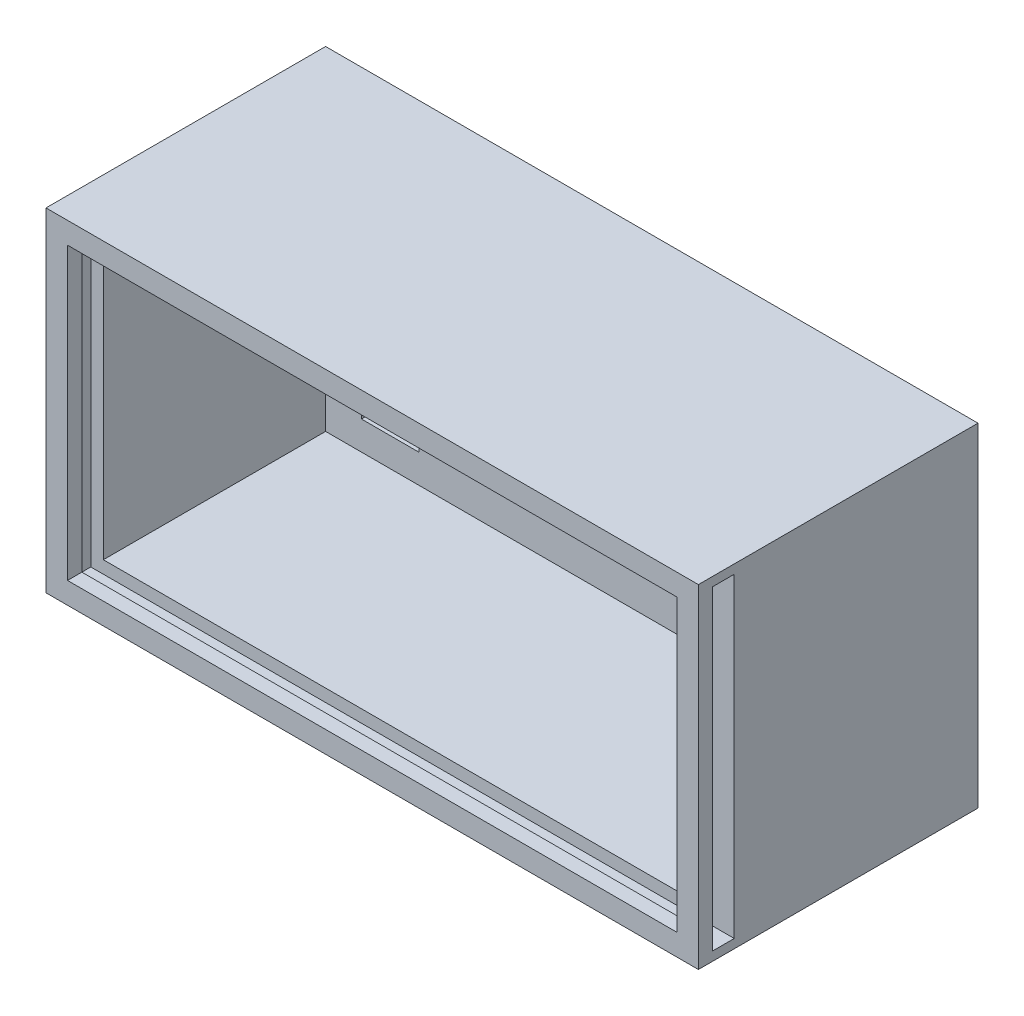
ISO-10303-21;
HEADER;
FILE_DESCRIPTION(('STEP AP214'),'2;1');
FILE_NAME('part.step','',(''),(''),'','','');
FILE_SCHEMA(('AUTOMOTIVE_DESIGN { 1 0 10303 214 1 1 1 1 }'));
ENDSEC;
DATA;
#1=APPLICATION_CONTEXT('core data for automotive mechanical design processes');
#2=APPLICATION_PROTOCOL_DEFINITION('international standard','automotive_design',2000,#1);
#3=PRODUCT_CONTEXT('',#1,'mechanical');
#4=PRODUCT('Part','Part','',(#3));
#5=PRODUCT_RELATED_PRODUCT_CATEGORY('part','',(#4));
#6=PRODUCT_DEFINITION_FORMATION('','',#4);
#7=PRODUCT_DEFINITION_CONTEXT('part definition',#1,'design');
#8=PRODUCT_DEFINITION('design','',#6,#7);
#9=PRODUCT_DEFINITION_SHAPE('','',#8);
#10=(LENGTH_UNIT() NAMED_UNIT(*) SI_UNIT(.MILLI.,.METRE.));
#11=(NAMED_UNIT(*) PLANE_ANGLE_UNIT() SI_UNIT($,.RADIAN.));
#12=(NAMED_UNIT(*) SI_UNIT($,.STERADIAN.) SOLID_ANGLE_UNIT());
#13=UNCERTAINTY_MEASURE_WITH_UNIT(LENGTH_MEASURE(1.E-05),#10,'distance_accuracy_value','');
#14=(GEOMETRIC_REPRESENTATION_CONTEXT(3) GLOBAL_UNCERTAINTY_ASSIGNED_CONTEXT((#13)) GLOBAL_UNIT_ASSIGNED_CONTEXT((#10,
#11,#12)) REPRESENTATION_CONTEXT('',''));
#15=CARTESIAN_POINT('',(0.,0.,0.));
#16=DIRECTION('',(0.,0.,1.));
#17=DIRECTION('',(1.,0.,0.));
#18=AXIS2_PLACEMENT_3D('',#15,#16,#17);
#19=CARTESIAN_POINT('',(0.,0.,36.));
#20=DIRECTION('',(0.,0.,-1.));
#21=DIRECTION('',(-1.,0.,0.));
#22=AXIS2_PLACEMENT_3D('',#19,#20,#21);
#23=PLANE('',#22);
#24=DIRECTION('',(0.,-1.,0.));
#25=VECTOR('',#24,1.);
#26=CARTESIAN_POINT('',(-45.5,23.25,36.));
#27=LINE('',#26,#25);
#28=CARTESIAN_POINT('',(-45.5,23.25,36.));
#29=VERTEX_POINT('',#28);
#30=CARTESIAN_POINT('',(-45.5,-23.25,36.));
#31=VERTEX_POINT('',#30);
#32=EDGE_CURVE('E337',#29,#31,#27,.T.);
#33=ORIENTED_EDGE('',*,*,#32,.T.);
#34=DIRECTION('',(1.,0.,0.));
#35=VECTOR('',#34,1.);
#36=CARTESIAN_POINT('',(45.5,-23.25,36.));
#37=LINE('',#36,#35);
#38=CARTESIAN_POINT('',(45.5,-23.25,36.));
#39=VERTEX_POINT('',#38);
#40=EDGE_CURVE('E340',#31,#39,#37,.T.);
#41=ORIENTED_EDGE('',*,*,#40,.T.);
#42=DIRECTION('',(0.,1.,0.));
#43=VECTOR('',#42,1.);
#44=CARTESIAN_POINT('',(45.5,23.25,36.));
#45=LINE('',#44,#43);
#46=CARTESIAN_POINT('',(45.5,23.25,36.));
#47=VERTEX_POINT('',#46);
#48=EDGE_CURVE('E342',#39,#47,#45,.T.);
#49=ORIENTED_EDGE('',*,*,#48,.T.);
#50=DIRECTION('',(-1.,0.,0.));
#51=VECTOR('',#50,1.);
#52=CARTESIAN_POINT('',(45.5,23.25,36.));
#53=LINE('',#52,#51);
#54=EDGE_CURVE('E344',#47,#29,#53,.T.);
#55=ORIENTED_EDGE('',*,*,#54,.T.);
#56=EDGE_LOOP('',(#33,#41,#49,#55));
#57=FACE_BOUND('',#56,.T.);
#58=DIRECTION('',(0.,-1.,0.));
#59=VECTOR('',#58,1.);
#60=CARTESIAN_POINT('',(-42.5,20.25,36.));
#61=LINE('',#60,#59);
#62=CARTESIAN_POINT('',(-42.5,20.25,36.));
#63=VERTEX_POINT('',#62);
#64=CARTESIAN_POINT('',(-42.5,-20.25,36.));
#65=VERTEX_POINT('',#64);
#66=EDGE_CURVE('E301',#63,#65,#61,.T.);
#67=ORIENTED_EDGE('',*,*,#66,.F.);
#68=DIRECTION('',(-1.,0.,0.));
#69=VECTOR('',#68,1.);
#70=CARTESIAN_POINT('',(-42.5,20.25,36.));
#71=LINE('',#70,#69);
#72=CARTESIAN_POINT('',(42.5,20.25,36.));
#73=VERTEX_POINT('',#72);
#74=EDGE_CURVE('E309',#73,#63,#71,.T.);
#75=ORIENTED_EDGE('',*,*,#74,.F.);
#76=DIRECTION('',(0.,1.,0.));
#77=VECTOR('',#76,1.);
#78=CARTESIAN_POINT('',(42.5,20.25,36.));
#79=LINE('',#78,#77);
#80=CARTESIAN_POINT('',(42.5,-20.25,36.));
#81=VERTEX_POINT('',#80);
#82=EDGE_CURVE('E306',#81,#73,#79,.T.);
#83=ORIENTED_EDGE('',*,*,#82,.F.);
#84=DIRECTION('',(1.,0.,0.));
#85=VECTOR('',#84,1.);
#86=CARTESIAN_POINT('',(-42.5,-20.25,36.));
#87=LINE('',#86,#85);
#88=EDGE_CURVE('E303',#65,#81,#87,.T.);
#89=ORIENTED_EDGE('',*,*,#88,.F.);
#90=EDGE_LOOP('',(#67,#75,#83,#89));
#91=FACE_BOUND('',#90,.T.);
#92=ADVANCED_FACE('F35',(#57,#91),#23,.F.);
#93=CARTESIAN_POINT('',(-45.5,23.25,36.));
#94=DIRECTION('',(1.,0.,0.));
#95=DIRECTION('',(0.,1.,0.));
#96=AXIS2_PLACEMENT_3D('',#93,#94,#95);
#97=PLANE('',#96);
#98=DIRECTION('',(0.,0.,-1.));
#99=VECTOR('',#98,1.);
#100=CARTESIAN_POINT('',(-45.5,23.25,36.));
#101=LINE('',#100,#99);
#102=CARTESIAN_POINT('',(-45.5,23.25,-3.));
#103=VERTEX_POINT('',#102);
#104=EDGE_CURVE('E346',#29,#103,#101,.T.);
#105=ORIENTED_EDGE('',*,*,#104,.T.);
#106=DIRECTION('',(0.,1.,0.));
#107=VECTOR('',#106,1.);
#108=CARTESIAN_POINT('',(-45.5,23.25,-3.));
#109=LINE('',#108,#107);
#110=CARTESIAN_POINT('',(-45.5,-23.25,-3.));
#111=VERTEX_POINT('',#110);
#112=EDGE_CURVE('E294',#111,#103,#109,.T.);
#113=ORIENTED_EDGE('',*,*,#112,.F.);
#114=DIRECTION('',(0.,0.,-1.));
#115=VECTOR('',#114,1.);
#116=CARTESIAN_POINT('',(-45.5,-23.25,36.));
#117=LINE('',#116,#115);
#118=EDGE_CURVE('E352',#31,#111,#117,.T.);
#119=ORIENTED_EDGE('',*,*,#118,.F.);
#120=ORIENTED_EDGE('',*,*,#32,.F.);
#121=EDGE_LOOP('',(#105,#113,#119,#120));
#122=FACE_BOUND('',#121,.T.);
#123=ADVANCED_FACE('F37',(#122),#97,.F.);
#124=CARTESIAN_POINT('',(45.5,-23.25,36.));
#125=DIRECTION('',(0.,1.,0.));
#126=DIRECTION('',(-1.,0.,0.));
#127=AXIS2_PLACEMENT_3D('',#124,#125,#126);
#128=PLANE('',#127);
#129=ORIENTED_EDGE('',*,*,#118,.T.);
#130=DIRECTION('',(-1.,0.,0.));
#131=VECTOR('',#130,1.);
#132=CARTESIAN_POINT('',(45.5,-23.25,-3.));
#133=LINE('',#132,#131);
#134=CARTESIAN_POINT('',(45.5,-23.25,-3.));
#135=VERTEX_POINT('',#134);
#136=EDGE_CURVE('E291',#135,#111,#133,.T.);
#137=ORIENTED_EDGE('',*,*,#136,.F.);
#138=DIRECTION('',(0.,0.,-1.));
#139=VECTOR('',#138,1.);
#140=CARTESIAN_POINT('',(45.5,-23.25,36.));
#141=LINE('',#140,#139);
#142=EDGE_CURVE('E350',#39,#135,#141,.T.);
#143=ORIENTED_EDGE('',*,*,#142,.F.);
#144=ORIENTED_EDGE('',*,*,#40,.F.);
#145=EDGE_LOOP('',(#129,#137,#143,#144));
#146=FACE_BOUND('',#145,.T.);
#147=ADVANCED_FACE('F405',(#146),#128,.F.);
#148=CARTESIAN_POINT('',(45.5,23.25,36.));
#149=DIRECTION('',(-1.,0.,0.));
#150=DIRECTION('',(0.,-1.,0.));
#151=AXIS2_PLACEMENT_3D('',#148,#149,#150);
#152=PLANE('',#151);
#153=DIRECTION('',(0.,0.,-1.));
#154=VECTOR('',#153,1.);
#155=CARTESIAN_POINT('',(45.5,-22.,36.));
#156=LINE('',#155,#154);
#157=CARTESIAN_POINT('',(45.5,-22.,34.));
#158=VERTEX_POINT('',#157);
#159=CARTESIAN_POINT('',(45.5,-22.,31.));
#160=VERTEX_POINT('',#159);
#161=EDGE_CURVE('E361',#158,#160,#156,.T.);
#162=ORIENTED_EDGE('',*,*,#161,.F.);
#163=DIRECTION('',(0.,1.,0.));
#164=VECTOR('',#163,1.);
#165=CARTESIAN_POINT('',(45.5,23.25,34.));
#166=LINE('',#165,#164);
#167=CARTESIAN_POINT('',(45.5,22.,34.));
#168=VERTEX_POINT('',#167);
#169=EDGE_CURVE('E285',#158,#168,#166,.T.);
#170=ORIENTED_EDGE('',*,*,#169,.T.);
#171=DIRECTION('',(0.,0.,1.));
#172=VECTOR('',#171,1.);
#173=CARTESIAN_POINT('',(45.5,22.,36.));
#174=LINE('',#173,#172);
#175=CARTESIAN_POINT('',(45.5,22.,31.));
#176=VERTEX_POINT('',#175);
#177=EDGE_CURVE('E359',#176,#168,#174,.T.);
#178=ORIENTED_EDGE('',*,*,#177,.F.);
#179=DIRECTION('',(0.,1.,0.));
#180=VECTOR('',#179,1.);
#181=CARTESIAN_POINT('',(45.5,23.25,31.));
#182=LINE('',#181,#180);
#183=EDGE_CURVE('E277',#160,#176,#182,.T.);
#184=ORIENTED_EDGE('',*,*,#183,.F.);
#185=EDGE_LOOP('',(#162,#170,#178,#184));
#186=FACE_BOUND('',#185,.T.);
#187=ORIENTED_EDGE('',*,*,#142,.T.);
#188=DIRECTION('',(0.,-1.,0.));
#189=VECTOR('',#188,1.);
#190=CARTESIAN_POINT('',(45.5,23.25,-3.));
#191=LINE('',#190,#189);
#192=CARTESIAN_POINT('',(45.5,23.25,-3.));
#193=VERTEX_POINT('',#192);
#194=EDGE_CURVE('E288',#193,#135,#191,.T.);
#195=ORIENTED_EDGE('',*,*,#194,.F.);
#196=DIRECTION('',(0.,0.,-1.));
#197=VECTOR('',#196,1.);
#198=CARTESIAN_POINT('',(45.5,23.25,36.));
#199=LINE('',#198,#197);
#200=EDGE_CURVE('E348',#47,#193,#199,.T.);
#201=ORIENTED_EDGE('',*,*,#200,.F.);
#202=ORIENTED_EDGE('',*,*,#48,.F.);
#203=EDGE_LOOP('',(#187,#195,#201,#202));
#204=FACE_BOUND('',#203,.T.);
#205=ADVANCED_FACE('F415',(#186,#204),#152,.F.);
#206=CARTESIAN_POINT('',(45.5,23.25,36.));
#207=DIRECTION('',(0.,-1.,0.));
#208=DIRECTION('',(1.,0.,0.));
#209=AXIS2_PLACEMENT_3D('',#206,#207,#208);
#210=PLANE('',#209);
#211=ORIENTED_EDGE('',*,*,#200,.T.);
#212=DIRECTION('',(1.,0.,0.));
#213=VECTOR('',#212,1.);
#214=CARTESIAN_POINT('',(45.5,23.25,-3.));
#215=LINE('',#214,#213);
#216=EDGE_CURVE('E297',#103,#193,#215,.T.);
#217=ORIENTED_EDGE('',*,*,#216,.F.);
#218=ORIENTED_EDGE('',*,*,#104,.F.);
#219=ORIENTED_EDGE('',*,*,#54,.F.);
#220=EDGE_LOOP('',(#211,#217,#218,#219));
#221=FACE_BOUND('',#220,.T.);
#222=ADVANCED_FACE('F412',(#221),#210,.F.);
#223=CARTESIAN_POINT('',(-42.5,20.25,36.));
#224=DIRECTION('',(1.,0.,0.));
#225=DIRECTION('',(0.,1.,0.));
#226=AXIS2_PLACEMENT_3D('',#223,#224,#225);
#227=PLANE('',#226);
#228=DIRECTION('',(0.,-1.,0.));
#229=VECTOR('',#228,1.);
#230=CARTESIAN_POINT('',(-42.5,20.25,34.));
#231=LINE('',#230,#229);
#232=CARTESIAN_POINT('',(-42.5,20.25,34.));
#233=VERTEX_POINT('',#232);
#234=CARTESIAN_POINT('',(-42.5,-20.25,34.));
#235=VERTEX_POINT('',#234);
#236=EDGE_CURVE('E283',#233,#235,#231,.T.);
#237=ORIENTED_EDGE('',*,*,#236,.F.);
#238=DIRECTION('',(0.,0.,-1.));
#239=VECTOR('',#238,1.);
#240=CARTESIAN_POINT('',(-42.5,20.25,36.));
#241=LINE('',#240,#239);
#242=EDGE_CURVE('E322',#63,#233,#241,.T.);
#243=ORIENTED_EDGE('',*,*,#242,.F.);
#244=ORIENTED_EDGE('',*,*,#66,.T.);
#245=DIRECTION('',(0.,0.,-1.));
#246=VECTOR('',#245,1.);
#247=CARTESIAN_POINT('',(-42.5,-20.25,36.));
#248=LINE('',#247,#246);
#249=EDGE_CURVE('E334',#65,#235,#248,.T.);
#250=ORIENTED_EDGE('',*,*,#249,.T.);
#251=EDGE_LOOP('',(#237,#243,#244,#250));
#252=FACE_BOUND('',#251,.T.);
#253=ADVANCED_FACE('F410',(#252),#227,.T.);
#254=CARTESIAN_POINT('',(-42.5,-20.25,36.));
#255=DIRECTION('',(0.,1.,0.));
#256=DIRECTION('',(-1.,0.,0.));
#257=AXIS2_PLACEMENT_3D('',#254,#255,#256);
#258=PLANE('',#257);
#259=DIRECTION('',(1.,0.,0.));
#260=VECTOR('',#259,1.);
#261=CARTESIAN_POINT('',(-42.5,-20.25,34.));
#262=LINE('',#261,#260);
#263=CARTESIAN_POINT('',(42.5,-20.25,34.));
#264=VERTEX_POINT('',#263);
#265=EDGE_CURVE('E281',#235,#264,#262,.T.);
#266=ORIENTED_EDGE('',*,*,#265,.F.);
#267=ORIENTED_EDGE('',*,*,#249,.F.);
#268=ORIENTED_EDGE('',*,*,#88,.T.);
#269=DIRECTION('',(0.,0.,-1.));
#270=VECTOR('',#269,1.);
#271=CARTESIAN_POINT('',(42.5,-20.25,36.));
#272=LINE('',#271,#270);
#273=EDGE_CURVE('E330',#81,#264,#272,.T.);
#274=ORIENTED_EDGE('',*,*,#273,.T.);
#275=EDGE_LOOP('',(#266,#267,#268,#274));
#276=FACE_BOUND('',#275,.T.);
#277=ADVANCED_FACE('F457',(#276),#258,.T.);
#278=CARTESIAN_POINT('',(42.5,20.25,36.));
#279=DIRECTION('',(-1.,0.,0.));
#280=DIRECTION('',(0.,-1.,0.));
#281=AXIS2_PLACEMENT_3D('',#278,#279,#280);
#282=PLANE('',#281);
#283=DIRECTION('',(0.,1.,0.));
#284=VECTOR('',#283,1.);
#285=CARTESIAN_POINT('',(42.5,20.25,34.));
#286=LINE('',#285,#284);
#287=CARTESIAN_POINT('',(42.5,20.25,34.));
#288=VERTEX_POINT('',#287);
#289=EDGE_CURVE('E279',#264,#288,#286,.T.);
#290=ORIENTED_EDGE('',*,*,#289,.F.);
#291=ORIENTED_EDGE('',*,*,#273,.F.);
#292=ORIENTED_EDGE('',*,*,#82,.T.);
#293=DIRECTION('',(0.,0.,-1.));
#294=VECTOR('',#293,1.);
#295=CARTESIAN_POINT('',(42.5,20.25,36.));
#296=LINE('',#295,#294);
#297=EDGE_CURVE('E326',#73,#288,#296,.T.);
#298=ORIENTED_EDGE('',*,*,#297,.T.);
#299=EDGE_LOOP('',(#290,#291,#292,#298));
#300=FACE_BOUND('',#299,.T.);
#301=ADVANCED_FACE('F447',(#300),#282,.T.);
#302=CARTESIAN_POINT('',(-42.5,20.25,36.));
#303=DIRECTION('',(0.,-1.,0.));
#304=DIRECTION('',(1.,0.,0.));
#305=AXIS2_PLACEMENT_3D('',#302,#303,#304);
#306=PLANE('',#305);
#307=DIRECTION('',(-1.,0.,0.));
#308=VECTOR('',#307,1.);
#309=CARTESIAN_POINT('',(-42.5,20.25,34.));
#310=LINE('',#309,#308);
#311=EDGE_CURVE('E357',#288,#233,#310,.T.);
#312=ORIENTED_EDGE('',*,*,#311,.F.);
#313=ORIENTED_EDGE('',*,*,#297,.F.);
#314=ORIENTED_EDGE('',*,*,#74,.T.);
#315=ORIENTED_EDGE('',*,*,#242,.T.);
#316=EDGE_LOOP('',(#312,#313,#314,#315));
#317=FACE_BOUND('',#316,.T.);
#318=ADVANCED_FACE('F438',(#317),#306,.T.);
#319=CARTESIAN_POINT('',(0.,0.,-3.));
#320=DIRECTION('',(0.,0.,-1.));
#321=DIRECTION('',(-1.,0.,0.));
#322=AXIS2_PLACEMENT_3D('',#319,#320,#321);
#323=PLANE('',#322);
#324=DIRECTION('',(0.,-1.,0.));
#325=VECTOR('',#324,1.);
#326=CARTESIAN_POINT('',(-29.5,-4.25000000000001,-3.));
#327=LINE('',#326,#325);
#328=CARTESIAN_POINT('',(-29.5,-4.25000000000001,-3.));
#329=VERTEX_POINT('',#328);
#330=CARTESIAN_POINT('',(-29.5,-16.25,-3.));
#331=VERTEX_POINT('',#330);
#332=EDGE_CURVE('E50',#329,#331,#327,.T.);
#333=ORIENTED_EDGE('',*,*,#332,.F.);
#334=DIRECTION('',(1.,0.,0.));
#335=VECTOR('',#334,1.);
#336=CARTESIAN_POINT('',(-29.5,-4.25000000000001,-3.));
#337=LINE('',#336,#335);
#338=CARTESIAN_POINT('',(-37.5,-4.25000000000001,-3.));
#339=VERTEX_POINT('',#338);
#340=EDGE_CURVE('E220',#339,#329,#337,.T.);
#341=ORIENTED_EDGE('',*,*,#340,.F.);
#342=DIRECTION('',(0.,1.,0.));
#343=VECTOR('',#342,1.);
#344=CARTESIAN_POINT('',(-37.5,-4.25000000000001,-3.));
#345=LINE('',#344,#343);
#346=CARTESIAN_POINT('',(-37.5,-16.25,-3.));
#347=VERTEX_POINT('',#346);
#348=EDGE_CURVE('E203',#347,#339,#345,.T.);
#349=ORIENTED_EDGE('',*,*,#348,.F.);
#350=DIRECTION('',(-1.,0.,0.));
#351=VECTOR('',#350,1.);
#352=CARTESIAN_POINT('',(-29.5,-16.25,-3.));
#353=LINE('',#352,#351);
#354=EDGE_CURVE('E213',#331,#347,#353,.T.);
#355=ORIENTED_EDGE('',*,*,#354,.F.);
#356=EDGE_LOOP('',(#333,#341,#349,#355));
#357=FACE_BOUND('',#356,.T.);
#358=DIRECTION('',(0.,-1.,0.));
#359=VECTOR('',#358,1.);
#360=CARTESIAN_POINT('',(40.1486426321158,17.25,-3.));
#361=LINE('',#360,#359);
#362=CARTESIAN_POINT('',(40.1486426321158,17.25,-3.));
#363=VERTEX_POINT('',#362);
#364=CARTESIAN_POINT('',(40.1486426321158,9.25000000000005,-3.));
#365=VERTEX_POINT('',#364);
#366=EDGE_CURVE('E58',#363,#365,#361,.T.);
#367=ORIENTED_EDGE('',*,*,#366,.F.);
#368=DIRECTION('',(1.,0.,0.));
#369=VECTOR('',#368,1.);
#370=CARTESIAN_POINT('',(40.1486426321158,17.25,-3.));
#371=LINE('',#370,#369);
#372=CARTESIAN_POINT('',(35.1486426321158,17.25,-3.));
#373=VERTEX_POINT('',#372);
#374=EDGE_CURVE('E237',#373,#363,#371,.T.);
#375=ORIENTED_EDGE('',*,*,#374,.F.);
#376=DIRECTION('',(0.,1.,0.));
#377=VECTOR('',#376,1.);
#378=CARTESIAN_POINT('',(35.1486426321158,17.25,-3.));
#379=LINE('',#378,#377);
#380=CARTESIAN_POINT('',(35.1486426321158,9.25000000000005,-3.));
#381=VERTEX_POINT('',#380);
#382=EDGE_CURVE('E234',#381,#373,#379,.T.);
#383=ORIENTED_EDGE('',*,*,#382,.F.);
#384=DIRECTION('',(-1.,0.,0.));
#385=VECTOR('',#384,1.);
#386=CARTESIAN_POINT('',(40.1486426321158,9.25000000000005,-3.));
#387=LINE('',#386,#385);
#388=EDGE_CURVE('E231',#365,#381,#387,.T.);
#389=ORIENTED_EDGE('',*,*,#388,.F.);
#390=EDGE_LOOP('',(#367,#375,#383,#389));
#391=FACE_BOUND('',#390,.T.);
#392=ORIENTED_EDGE('',*,*,#194,.T.);
#393=ORIENTED_EDGE('',*,*,#136,.T.);
#394=ORIENTED_EDGE('',*,*,#112,.T.);
#395=ORIENTED_EDGE('',*,*,#216,.T.);
#396=EDGE_LOOP('',(#392,#393,#394,#395));
#397=FACE_BOUND('',#396,.T.);
#398=ADVANCED_FACE('F217',(#357,#391,#397),#323,.T.);
#399=CARTESIAN_POINT('',(-44.25,-22.,34.));
#400=DIRECTION('',(0.,1.,0.));
#401=DIRECTION('',(-1.,0.,0.));
#402=AXIS2_PLACEMENT_3D('',#399,#400,#401);
#403=PLANE('',#402);
#404=ORIENTED_EDGE('',*,*,#161,.T.);
#405=DIRECTION('',(1.,0.,0.));
#406=VECTOR('',#405,1.);
#407=CARTESIAN_POINT('',(-44.25,-22.,31.));
#408=LINE('',#407,#406);
#409=CARTESIAN_POINT('',(-44.25,-22.,31.));
#410=VERTEX_POINT('',#409);
#411=EDGE_CURVE('E260',#410,#160,#408,.T.);
#412=ORIENTED_EDGE('',*,*,#411,.F.);
#413=DIRECTION('',(0.,0.,-1.));
#414=VECTOR('',#413,1.);
#415=CARTESIAN_POINT('',(-44.25,-22.,34.));
#416=LINE('',#415,#414);
#417=CARTESIAN_POINT('',(-44.25,-22.,34.));
#418=VERTEX_POINT('',#417);
#419=EDGE_CURVE('E265',#418,#410,#416,.T.);
#420=ORIENTED_EDGE('',*,*,#419,.F.);
#421=DIRECTION('',(1.,0.,0.));
#422=VECTOR('',#421,1.);
#423=CARTESIAN_POINT('',(-44.25,-22.,34.));
#424=LINE('',#423,#422);
#425=EDGE_CURVE('E251',#418,#158,#424,.T.);
#426=ORIENTED_EDGE('',*,*,#425,.T.);
#427=EDGE_LOOP('',(#404,#412,#420,#426));
#428=FACE_BOUND('',#427,.T.);
#429=ADVANCED_FACE('F437',(#428),#403,.T.);
#430=CARTESIAN_POINT('',(-44.25,22.,34.));
#431=DIRECTION('',(0.,-1.,0.));
#432=DIRECTION('',(0.,0.,-1.));
#433=AXIS2_PLACEMENT_3D('',#430,#431,#432);
#434=PLANE('',#433);
#435=ORIENTED_EDGE('',*,*,#177,.T.);
#436=DIRECTION('',(-1.,0.,0.));
#437=VECTOR('',#436,1.);
#438=CARTESIAN_POINT('',(-44.25,22.,34.));
#439=LINE('',#438,#437);
#440=CARTESIAN_POINT('',(-44.25,22.,34.));
#441=VERTEX_POINT('',#440);
#442=EDGE_CURVE('E255',#168,#441,#439,.T.);
#443=ORIENTED_EDGE('',*,*,#442,.T.);
#444=DIRECTION('',(0.,0.,-1.));
#445=VECTOR('',#444,1.);
#446=CARTESIAN_POINT('',(-44.25,22.,34.));
#447=LINE('',#446,#445);
#448=CARTESIAN_POINT('',(-44.25,22.,31.));
#449=VERTEX_POINT('',#448);
#450=EDGE_CURVE('E257',#441,#449,#447,.T.);
#451=ORIENTED_EDGE('',*,*,#450,.T.);
#452=DIRECTION('',(-1.,0.,0.));
#453=VECTOR('',#452,1.);
#454=CARTESIAN_POINT('',(-44.25,22.,31.));
#455=LINE('',#454,#453);
#456=EDGE_CURVE('E252',#176,#449,#455,.T.);
#457=ORIENTED_EDGE('',*,*,#456,.F.);
#458=EDGE_LOOP('',(#435,#443,#451,#457));
#459=FACE_BOUND('',#458,.T.);
#460=ADVANCED_FACE('F444',(#459),#434,.T.);
#461=CARTESIAN_POINT('',(0.,0.,34.));
#462=DIRECTION('',(0.,0.,1.));
#463=DIRECTION('',(1.,0.,0.));
#464=AXIS2_PLACEMENT_3D('',#461,#462,#463);
#465=PLANE('',#464);
#466=ORIENTED_EDGE('',*,*,#236,.T.);
#467=ORIENTED_EDGE('',*,*,#265,.T.);
#468=ORIENTED_EDGE('',*,*,#289,.T.);
#469=ORIENTED_EDGE('',*,*,#311,.T.);
#470=EDGE_LOOP('',(#466,#467,#468,#469));
#471=FACE_BOUND('',#470,.T.);
#472=ORIENTED_EDGE('',*,*,#425,.F.);
#473=DIRECTION('',(0.,-1.,0.));
#474=VECTOR('',#473,1.);
#475=CARTESIAN_POINT('',(-44.25,22.,34.));
#476=LINE('',#475,#474);
#477=EDGE_CURVE('E248',#441,#418,#476,.T.);
#478=ORIENTED_EDGE('',*,*,#477,.F.);
#479=ORIENTED_EDGE('',*,*,#442,.F.);
#480=ORIENTED_EDGE('',*,*,#169,.F.);
#481=EDGE_LOOP('',(#472,#478,#479,#480));
#482=FACE_BOUND('',#481,.T.);
#483=ADVANCED_FACE('F585',(#471,#482),#465,.F.);
#484=CARTESIAN_POINT('',(0.,0.,31.));
#485=DIRECTION('',(0.,0.,1.));
#486=DIRECTION('',(1.,0.,0.));
#487=AXIS2_PLACEMENT_3D('',#484,#485,#486);
#488=PLANE('',#487);
#489=DIRECTION('',(-1.,0.,0.));
#490=VECTOR('',#489,1.);
#491=CARTESIAN_POINT('',(-42.5,20.25,31.));
#492=LINE('',#491,#490);
#493=CARTESIAN_POINT('',(42.5,20.25,31.));
#494=VERTEX_POINT('',#493);
#495=CARTESIAN_POINT('',(-42.5,20.25,31.));
#496=VERTEX_POINT('',#495);
#497=EDGE_CURVE('E354',#494,#496,#492,.T.);
#498=ORIENTED_EDGE('',*,*,#497,.F.);
#499=DIRECTION('',(0.,1.,0.));
#500=VECTOR('',#499,1.);
#501=CARTESIAN_POINT('',(42.5,20.25,31.));
#502=LINE('',#501,#500);
#503=CARTESIAN_POINT('',(42.5,-20.25,31.));
#504=VERTEX_POINT('',#503);
#505=EDGE_CURVE('E268',#504,#494,#502,.T.);
#506=ORIENTED_EDGE('',*,*,#505,.F.);
#507=DIRECTION('',(1.,0.,0.));
#508=VECTOR('',#507,1.);
#509=CARTESIAN_POINT('',(-42.5,-20.25,31.));
#510=LINE('',#509,#508);
#511=CARTESIAN_POINT('',(-42.5,-20.25,31.));
#512=VERTEX_POINT('',#511);
#513=EDGE_CURVE('E271',#512,#504,#510,.T.);
#514=ORIENTED_EDGE('',*,*,#513,.F.);
#515=DIRECTION('',(0.,-1.,0.));
#516=VECTOR('',#515,1.);
#517=CARTESIAN_POINT('',(-42.5,20.25,31.));
#518=LINE('',#517,#516);
#519=EDGE_CURVE('E274',#496,#512,#518,.T.);
#520=ORIENTED_EDGE('',*,*,#519,.F.);
#521=EDGE_LOOP('',(#498,#506,#514,#520));
#522=FACE_BOUND('',#521,.T.);
#523=ORIENTED_EDGE('',*,*,#183,.T.);
#524=ORIENTED_EDGE('',*,*,#456,.T.);
#525=DIRECTION('',(0.,-1.,0.));
#526=VECTOR('',#525,1.);
#527=CARTESIAN_POINT('',(-44.25,22.,31.));
#528=LINE('',#527,#526);
#529=EDGE_CURVE('E227',#449,#410,#528,.T.);
#530=ORIENTED_EDGE('',*,*,#529,.T.);
#531=ORIENTED_EDGE('',*,*,#411,.T.);
#532=EDGE_LOOP('',(#523,#524,#530,#531));
#533=FACE_BOUND('',#532,.T.);
#534=ADVANCED_FACE('F484',(#522,#533),#488,.T.);
#535=CARTESIAN_POINT('',(-44.25,22.,34.));
#536=DIRECTION('',(1.,0.,0.));
#537=DIRECTION('',(0.,1.,0.));
#538=AXIS2_PLACEMENT_3D('',#535,#536,#537);
#539=PLANE('',#538);
#540=ORIENTED_EDGE('',*,*,#529,.F.);
#541=ORIENTED_EDGE('',*,*,#450,.F.);
#542=ORIENTED_EDGE('',*,*,#477,.T.);
#543=ORIENTED_EDGE('',*,*,#419,.T.);
#544=EDGE_LOOP('',(#540,#541,#542,#543));
#545=FACE_BOUND('',#544,.T.);
#546=ADVANCED_FACE('F453',(#545),#539,.T.);
#547=CARTESIAN_POINT('',(0.,0.,0.));
#548=DIRECTION('',(0.,0.,-1.));
#549=DIRECTION('',(-1.,0.,0.));
#550=AXIS2_PLACEMENT_3D('',#547,#548,#549);
#551=PLANE('',#550);
#552=DIRECTION('',(1.,0.,0.));
#553=VECTOR('',#552,1.);
#554=CARTESIAN_POINT('',(0.,-4.25000000000001,0.));
#555=LINE('',#554,#553);
#556=CARTESIAN_POINT('',(-37.5,-4.25000000000001,0.));
#557=VERTEX_POINT('',#556);
#558=CARTESIAN_POINT('',(-29.5,-4.25000000000001,0.));
#559=VERTEX_POINT('',#558);
#560=EDGE_CURVE('E43',#557,#559,#555,.T.);
#561=ORIENTED_EDGE('',*,*,#560,.T.);
#562=DIRECTION('',(0.,-1.,0.));
#563=VECTOR('',#562,1.);
#564=CARTESIAN_POINT('',(-29.5,0.,0.));
#565=LINE('',#564,#563);
#566=CARTESIAN_POINT('',(-29.5,-16.25,0.));
#567=VERTEX_POINT('',#566);
#568=EDGE_CURVE('E11',#559,#567,#565,.T.);
#569=ORIENTED_EDGE('',*,*,#568,.T.);
#570=DIRECTION('',(-1.,0.,0.));
#571=VECTOR('',#570,1.);
#572=CARTESIAN_POINT('',(0.,-16.25,0.));
#573=LINE('',#572,#571);
#574=CARTESIAN_POINT('',(-37.5,-16.25,0.));
#575=VERTEX_POINT('',#574);
#576=EDGE_CURVE('E376',#567,#575,#573,.T.);
#577=ORIENTED_EDGE('',*,*,#576,.T.);
#578=DIRECTION('',(0.,1.,0.));
#579=VECTOR('',#578,1.);
#580=CARTESIAN_POINT('',(-37.5,0.,0.));
#581=LINE('',#580,#579);
#582=EDGE_CURVE('E206',#575,#557,#581,.T.);
#583=ORIENTED_EDGE('',*,*,#582,.T.);
#584=EDGE_LOOP('',(#561,#569,#577,#583));
#585=FACE_BOUND('',#584,.T.);
#586=DIRECTION('',(1.,0.,0.));
#587=VECTOR('',#586,1.);
#588=CARTESIAN_POINT('',(0.,17.2500000000001,0.));
#589=LINE('',#588,#587);
#590=CARTESIAN_POINT('',(35.1486426321158,17.25,0.));
#591=VERTEX_POINT('',#590);
#592=CARTESIAN_POINT('',(40.1486426321158,17.25,0.));
#593=VERTEX_POINT('',#592);
#594=EDGE_CURVE('E370',#591,#593,#589,.T.);
#595=ORIENTED_EDGE('',*,*,#594,.T.);
#596=DIRECTION('',(0.,-1.,0.));
#597=VECTOR('',#596,1.);
#598=CARTESIAN_POINT('',(40.1486426321158,0.,0.));
#599=LINE('',#598,#597);
#600=CARTESIAN_POINT('',(40.1486426321158,9.25000000000005,0.));
#601=VERTEX_POINT('',#600);
#602=EDGE_CURVE('E373',#593,#601,#599,.T.);
#603=ORIENTED_EDGE('',*,*,#602,.T.);
#604=DIRECTION('',(-1.,0.,0.));
#605=VECTOR('',#604,1.);
#606=CARTESIAN_POINT('',(0.,9.25000000000005,0.));
#607=LINE('',#606,#605);
#608=CARTESIAN_POINT('',(35.1486426321158,9.25000000000005,0.));
#609=VERTEX_POINT('',#608);
#610=EDGE_CURVE('E364',#601,#609,#607,.T.);
#611=ORIENTED_EDGE('',*,*,#610,.T.);
#612=DIRECTION('',(0.,1.,0.));
#613=VECTOR('',#612,1.);
#614=CARTESIAN_POINT('',(35.1486426321158,0.,0.));
#615=LINE('',#614,#613);
#616=EDGE_CURVE('E367',#609,#591,#615,.T.);
#617=ORIENTED_EDGE('',*,*,#616,.T.);
#618=EDGE_LOOP('',(#595,#603,#611,#617));
#619=FACE_BOUND('',#618,.T.);
#620=DIRECTION('',(0.,1.,0.));
#621=VECTOR('',#620,1.);
#622=CARTESIAN_POINT('',(42.5,20.25,0.));
#623=LINE('',#622,#621);
#624=CARTESIAN_POINT('',(42.5,-20.25,0.));
#625=VERTEX_POINT('',#624);
#626=CARTESIAN_POINT('',(42.5,20.25,0.));
#627=VERTEX_POINT('',#626);
#628=EDGE_CURVE('E317',#625,#627,#623,.T.);
#629=ORIENTED_EDGE('',*,*,#628,.T.);
#630=DIRECTION('',(-1.,0.,0.));
#631=VECTOR('',#630,1.);
#632=CARTESIAN_POINT('',(-42.5,20.25,0.));
#633=LINE('',#632,#631);
#634=CARTESIAN_POINT('',(-42.5,20.25,0.));
#635=VERTEX_POINT('',#634);
#636=EDGE_CURVE('E304',#627,#635,#633,.T.);
#637=ORIENTED_EDGE('',*,*,#636,.T.);
#638=DIRECTION('',(0.,-1.,0.));
#639=VECTOR('',#638,1.);
#640=CARTESIAN_POINT('',(-42.5,20.25,0.));
#641=LINE('',#640,#639);
#642=CARTESIAN_POINT('',(-42.5,-20.25,0.));
#643=VERTEX_POINT('',#642);
#644=EDGE_CURVE('E300',#635,#643,#641,.T.);
#645=ORIENTED_EDGE('',*,*,#644,.T.);
#646=DIRECTION('',(1.,0.,0.));
#647=VECTOR('',#646,1.);
#648=CARTESIAN_POINT('',(-42.5,-20.25,0.));
#649=LINE('',#648,#647);
#650=EDGE_CURVE('E314',#643,#625,#649,.T.);
#651=ORIENTED_EDGE('',*,*,#650,.T.);
#652=EDGE_LOOP('',(#629,#637,#645,#651));
#653=FACE_BOUND('',#652,.T.);
#654=ADVANCED_FACE('F380',(#585,#619,#653),#551,.F.);
#655=EDGE_CURVE('E325',#494,#627,#296,.T.);
#656=ORIENTED_EDGE('',*,*,#655,.F.);
#657=ORIENTED_EDGE('',*,*,#497,.T.);
#658=EDGE_CURVE('E311',#496,#635,#241,.T.);
#659=ORIENTED_EDGE('',*,*,#658,.T.);
#660=ORIENTED_EDGE('',*,*,#636,.F.);
#661=EDGE_LOOP('',(#656,#657,#659,#660));
#662=FACE_BOUND('',#661,.T.);
#663=ADVANCED_FACE('F450',(#662),#306,.T.);
#664=EDGE_CURVE('E329',#504,#625,#272,.T.);
#665=ORIENTED_EDGE('',*,*,#664,.F.);
#666=ORIENTED_EDGE('',*,*,#505,.T.);
#667=ORIENTED_EDGE('',*,*,#655,.T.);
#668=ORIENTED_EDGE('',*,*,#628,.F.);
#669=EDGE_LOOP('',(#665,#666,#667,#668));
#670=FACE_BOUND('',#669,.T.);
#671=ADVANCED_FACE('F459',(#670),#282,.T.);
#672=EDGE_CURVE('E333',#512,#643,#248,.T.);
#673=ORIENTED_EDGE('',*,*,#672,.F.);
#674=ORIENTED_EDGE('',*,*,#513,.T.);
#675=ORIENTED_EDGE('',*,*,#664,.T.);
#676=ORIENTED_EDGE('',*,*,#650,.F.);
#677=EDGE_LOOP('',(#673,#674,#675,#676));
#678=FACE_BOUND('',#677,.T.);
#679=ADVANCED_FACE('F462',(#678),#258,.T.);
#680=ORIENTED_EDGE('',*,*,#658,.F.);
#681=ORIENTED_EDGE('',*,*,#519,.T.);
#682=ORIENTED_EDGE('',*,*,#672,.T.);
#683=ORIENTED_EDGE('',*,*,#644,.F.);
#684=EDGE_LOOP('',(#680,#681,#682,#683));
#685=FACE_BOUND('',#684,.T.);
#686=ADVANCED_FACE('F467',(#685),#227,.T.);
#687=CARTESIAN_POINT('',(40.1486426321158,17.25,7.));
#688=DIRECTION('',(1.,0.,0.));
#689=DIRECTION('',(0.,0.,-1.));
#690=AXIS2_PLACEMENT_3D('',#687,#688,#689);
#691=PLANE('',#690);
#692=DIRECTION('',(0.,0.,-1.));
#693=VECTOR('',#692,1.);
#694=CARTESIAN_POINT('',(40.1486426321158,17.25,7.));
#695=LINE('',#694,#693);
#696=EDGE_CURVE('E241',#593,#363,#695,.T.);
#697=ORIENTED_EDGE('',*,*,#696,.T.);
#698=ORIENTED_EDGE('',*,*,#366,.T.);
#699=DIRECTION('',(0.,0.,-1.));
#700=VECTOR('',#699,1.);
#701=CARTESIAN_POINT('',(40.1486426321158,9.25000000000005,7.));
#702=LINE('',#701,#700);
#703=EDGE_CURVE('E240',#601,#365,#702,.T.);
#704=ORIENTED_EDGE('',*,*,#703,.F.);
#705=ORIENTED_EDGE('',*,*,#602,.F.);
#706=EDGE_LOOP('',(#697,#698,#704,#705));
#707=FACE_BOUND('',#706,.T.);
#708=ADVANCED_FACE('F475',(#707),#691,.F.);
#709=CARTESIAN_POINT('',(40.1486426321158,17.25,7.));
#710=DIRECTION('',(0.,1.,0.));
#711=DIRECTION('',(-1.,0.,0.));
#712=AXIS2_PLACEMENT_3D('',#709,#710,#711);
#713=PLANE('',#712);
#714=DIRECTION('',(0.,0.,-1.));
#715=VECTOR('',#714,1.);
#716=CARTESIAN_POINT('',(35.1486426321158,17.25,7.));
#717=LINE('',#716,#715);
#718=EDGE_CURVE('E243',#591,#373,#717,.T.);
#719=ORIENTED_EDGE('',*,*,#718,.T.);
#720=ORIENTED_EDGE('',*,*,#374,.T.);
#721=ORIENTED_EDGE('',*,*,#696,.F.);
#722=ORIENTED_EDGE('',*,*,#594,.F.);
#723=EDGE_LOOP('',(#719,#720,#721,#722));
#724=FACE_BOUND('',#723,.T.);
#725=ADVANCED_FACE('F531',(#724),#713,.F.);
#726=CARTESIAN_POINT('',(35.1486426321158,17.25,7.));
#727=DIRECTION('',(-1.,0.,0.));
#728=DIRECTION('',(0.,0.,1.));
#729=AXIS2_PLACEMENT_3D('',#726,#727,#728);
#730=PLANE('',#729);
#731=DIRECTION('',(0.,0.,-1.));
#732=VECTOR('',#731,1.);
#733=CARTESIAN_POINT('',(35.1486426321158,9.25000000000005,7.));
#734=LINE('',#733,#732);
#735=EDGE_CURVE('E245',#609,#381,#734,.T.);
#736=ORIENTED_EDGE('',*,*,#735,.T.);
#737=ORIENTED_EDGE('',*,*,#382,.T.);
#738=ORIENTED_EDGE('',*,*,#718,.F.);
#739=ORIENTED_EDGE('',*,*,#616,.F.);
#740=EDGE_LOOP('',(#736,#737,#738,#739));
#741=FACE_BOUND('',#740,.T.);
#742=ADVANCED_FACE('F394',(#741),#730,.F.);
#743=CARTESIAN_POINT('',(40.1486426321158,9.25000000000005,7.));
#744=DIRECTION('',(0.,-1.,0.));
#745=DIRECTION('',(0.,0.,-1.));
#746=AXIS2_PLACEMENT_3D('',#743,#744,#745);
#747=PLANE('',#746);
#748=ORIENTED_EDGE('',*,*,#703,.T.);
#749=ORIENTED_EDGE('',*,*,#388,.T.);
#750=ORIENTED_EDGE('',*,*,#735,.F.);
#751=ORIENTED_EDGE('',*,*,#610,.F.);
#752=EDGE_LOOP('',(#748,#749,#750,#751));
#753=FACE_BOUND('',#752,.T.);
#754=ADVANCED_FACE('F387',(#753),#747,.F.);
#755=CARTESIAN_POINT('',(-29.5,-4.25000000000001,7.));
#756=DIRECTION('',(1.,0.,0.));
#757=DIRECTION('',(0.,1.,0.));
#758=AXIS2_PLACEMENT_3D('',#755,#756,#757);
#759=PLANE('',#758);
#760=DIRECTION('',(0.,0.,-1.));
#761=VECTOR('',#760,1.);
#762=CARTESIAN_POINT('',(-29.5,-4.25000000000001,7.));
#763=LINE('',#762,#761);
#764=EDGE_CURVE('E225',#559,#329,#763,.T.);
#765=ORIENTED_EDGE('',*,*,#764,.T.);
#766=ORIENTED_EDGE('',*,*,#332,.T.);
#767=DIRECTION('',(0.,0.,-1.));
#768=VECTOR('',#767,1.);
#769=CARTESIAN_POINT('',(-29.5,-16.25,7.));
#770=LINE('',#769,#768);
#771=EDGE_CURVE('E210',#567,#331,#770,.T.);
#772=ORIENTED_EDGE('',*,*,#771,.F.);
#773=ORIENTED_EDGE('',*,*,#568,.F.);
#774=EDGE_LOOP('',(#765,#766,#772,#773));
#775=FACE_BOUND('',#774,.T.);
#776=ADVANCED_FACE('F385',(#775),#759,.F.);
#777=CARTESIAN_POINT('',(-29.5,-4.25000000000001,7.));
#778=DIRECTION('',(0.,1.,0.));
#779=DIRECTION('',(0.,0.,1.));
#780=AXIS2_PLACEMENT_3D('',#777,#778,#779);
#781=PLANE('',#780);
#782=DIRECTION('',(0.,0.,-1.));
#783=VECTOR('',#782,1.);
#784=CARTESIAN_POINT('',(-37.5,-4.25000000000001,7.));
#785=LINE('',#784,#783);
#786=EDGE_CURVE('E209',#557,#339,#785,.T.);
#787=ORIENTED_EDGE('',*,*,#786,.T.);
#788=ORIENTED_EDGE('',*,*,#340,.T.);
#789=ORIENTED_EDGE('',*,*,#764,.F.);
#790=ORIENTED_EDGE('',*,*,#560,.F.);
#791=EDGE_LOOP('',(#787,#788,#789,#790));
#792=FACE_BOUND('',#791,.T.);
#793=ADVANCED_FACE('F384',(#792),#781,.F.);
#794=CARTESIAN_POINT('',(-37.5,-4.25000000000001,7.));
#795=DIRECTION('',(-1.,0.,0.));
#796=DIRECTION('',(0.,0.,1.));
#797=AXIS2_PLACEMENT_3D('',#794,#795,#796);
#798=PLANE('',#797);
#799=DIRECTION('',(0.,0.,-1.));
#800=VECTOR('',#799,1.);
#801=CARTESIAN_POINT('',(-37.5,-16.25,7.));
#802=LINE('',#801,#800);
#803=EDGE_CURVE('E198',#575,#347,#802,.T.);
#804=ORIENTED_EDGE('',*,*,#803,.T.);
#805=ORIENTED_EDGE('',*,*,#348,.T.);
#806=ORIENTED_EDGE('',*,*,#786,.F.);
#807=ORIENTED_EDGE('',*,*,#582,.F.);
#808=EDGE_LOOP('',(#804,#805,#806,#807));
#809=FACE_BOUND('',#808,.T.);
#810=ADVANCED_FACE('F200',(#809),#798,.F.);
#811=CARTESIAN_POINT('',(-29.5,-16.25,7.));
#812=DIRECTION('',(0.,-1.,0.));
#813=DIRECTION('',(0.,0.,-1.));
#814=AXIS2_PLACEMENT_3D('',#811,#812,#813);
#815=PLANE('',#814);
#816=ORIENTED_EDGE('',*,*,#771,.T.);
#817=ORIENTED_EDGE('',*,*,#354,.T.);
#818=ORIENTED_EDGE('',*,*,#803,.F.);
#819=ORIENTED_EDGE('',*,*,#576,.F.);
#820=EDGE_LOOP('',(#816,#817,#818,#819));
#821=FACE_BOUND('',#820,.T.);
#822=ADVANCED_FACE('F214',(#821),#815,.F.);
#823=CLOSED_SHELL('',(#92,#123,#147,#205,#222,#253,#277,#301,#318,#398,#429,#460,#483,#534,#546,
#654,#663,#671,#679,#686,#708,#725,#742,#754,#776,#793,#810,#822));
#824=MANIFOLD_SOLID_BREP('B2',#823);
#825=ADVANCED_BREP_SHAPE_REPRESENTATION('',(#18,#824),#14);
#826=SHAPE_DEFINITION_REPRESENTATION(#9,#825);
ENDSEC;
END-ISO-10303-21;
